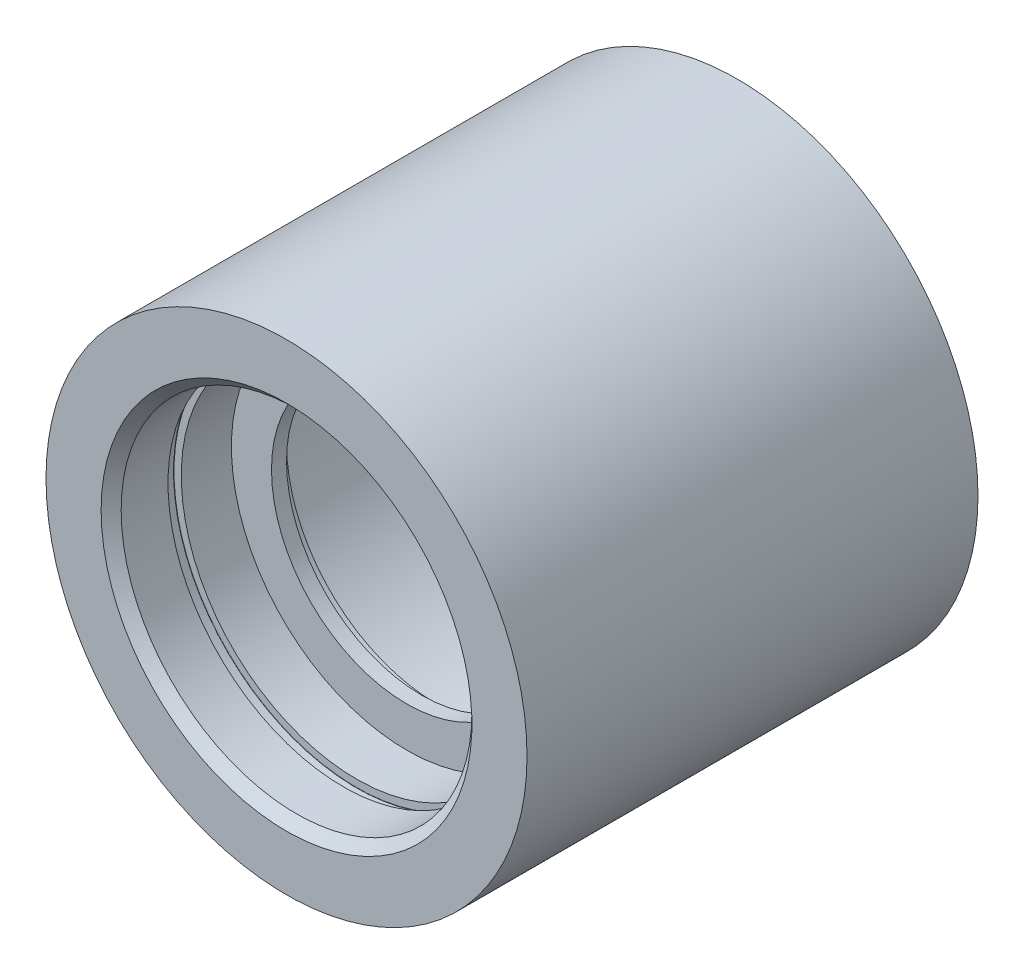
ISO-10303-21;
HEADER;
FILE_DESCRIPTION(('STEP AP214'),'2;1');
FILE_NAME('part.step','',(''),(''),'','','');
FILE_SCHEMA(('AUTOMOTIVE_DESIGN { 1 0 10303 214 1 1 1 1 }'));
ENDSEC;
DATA;
#1=APPLICATION_CONTEXT('core data for automotive mechanical design processes');
#2=APPLICATION_PROTOCOL_DEFINITION('international standard','automotive_design',2000,#1);
#3=PRODUCT_CONTEXT('',#1,'mechanical');
#4=PRODUCT('Part','Part','',(#3));
#5=PRODUCT_RELATED_PRODUCT_CATEGORY('part','',(#4));
#6=PRODUCT_DEFINITION_FORMATION('','',#4);
#7=PRODUCT_DEFINITION_CONTEXT('part definition',#1,'design');
#8=PRODUCT_DEFINITION('design','',#6,#7);
#9=PRODUCT_DEFINITION_SHAPE('','',#8);
#10=(LENGTH_UNIT() NAMED_UNIT(*) SI_UNIT(.MILLI.,.METRE.));
#11=(NAMED_UNIT(*) PLANE_ANGLE_UNIT() SI_UNIT($,.RADIAN.));
#12=(NAMED_UNIT(*) SI_UNIT($,.STERADIAN.) SOLID_ANGLE_UNIT());
#13=UNCERTAINTY_MEASURE_WITH_UNIT(LENGTH_MEASURE(1.E-05),#10,'distance_accuracy_value','');
#14=(GEOMETRIC_REPRESENTATION_CONTEXT(3) GLOBAL_UNCERTAINTY_ASSIGNED_CONTEXT((#13)) GLOBAL_UNIT_ASSIGNED_CONTEXT((#10,
#11,#12)) REPRESENTATION_CONTEXT('',''));
#15=CARTESIAN_POINT('',(0.,0.,0.));
#16=DIRECTION('',(0.,0.,1.));
#17=DIRECTION('',(1.,0.,0.));
#18=AXIS2_PLACEMENT_3D('',#15,#16,#17);
#19=CARTESIAN_POINT('',(0.,0.,0.));
#20=DIRECTION('',(0.,0.,1.));
#21=DIRECTION('',(1.,0.,0.));
#22=AXIS2_PLACEMENT_3D('',#19,#20,#21);
#23=CYLINDRICAL_SURFACE('',#22,40.);
#24=CARTESIAN_POINT('',(0.,0.,-30.));
#25=DIRECTION('',(0.,0.,1.));
#26=DIRECTION('',(1.,0.,0.));
#27=AXIS2_PLACEMENT_3D('',#24,#25,#26);
#28=CIRCLE('',#27,40.);
#29=CARTESIAN_POINT('',(40.,0.,-30.));
#30=VERTEX_POINT('',#29);
#31=EDGE_CURVE('E103',#30,#30,#28,.T.);
#32=ORIENTED_EDGE('',*,*,#31,.T.);
#33=EDGE_LOOP('',(#32));
#34=FACE_BOUND('',#33,.T.);
#35=CARTESIAN_POINT('',(0.,0.,-69.));
#36=DIRECTION('',(0.,0.,-1.));
#37=DIRECTION('',(-1.,0.,0.));
#38=AXIS2_PLACEMENT_3D('',#35,#36,#37);
#39=CIRCLE('',#38,40.);
#40=CARTESIAN_POINT('',(-40.,0.,-69.));
#41=VERTEX_POINT('',#40);
#42=EDGE_CURVE('E92',#41,#41,#39,.F.);
#43=ORIENTED_EDGE('',*,*,#42,.F.);
#44=EDGE_LOOP('',(#43));
#45=FACE_BOUND('',#44,.T.);
#46=ADVANCED_FACE('F41',(#34,#45),#23,.F.);
#47=CARTESIAN_POINT('',(0.,0.,0.));
#48=DIRECTION('',(0.,0.,1.));
#49=DIRECTION('',(1.,0.,0.));
#50=AXIS2_PLACEMENT_3D('',#47,#48,#49);
#51=CYLINDRICAL_SURFACE('',#50,35.);
#52=CARTESIAN_POINT('',(0.,0.,-24.));
#53=DIRECTION('',(0.,0.,1.));
#54=DIRECTION('',(1.,0.,0.));
#55=AXIS2_PLACEMENT_3D('',#52,#53,#54);
#56=CIRCLE('',#55,35.);
#57=CARTESIAN_POINT('',(35.,0.,-24.));
#58=VERTEX_POINT('',#57);
#59=EDGE_CURVE('E100',#58,#58,#56,.T.);
#60=ORIENTED_EDGE('',*,*,#59,.F.);
#61=EDGE_LOOP('',(#60));
#62=FACE_BOUND('',#61,.T.);
#63=CARTESIAN_POINT('',(0.,0.,-14.));
#64=DIRECTION('',(0.,0.,1.));
#65=DIRECTION('',(1.,0.,0.));
#66=AXIS2_PLACEMENT_3D('',#63,#64,#65);
#67=CIRCLE('',#66,35.);
#68=CARTESIAN_POINT('',(35.,0.,-14.));
#69=VERTEX_POINT('',#68);
#70=EDGE_CURVE('E87',#69,#69,#67,.F.);
#71=ORIENTED_EDGE('',*,*,#70,.F.);
#72=EDGE_LOOP('',(#71));
#73=FACE_BOUND('',#72,.T.);
#74=ADVANCED_FACE('F124',(#62,#73),#51,.F.);
#75=CARTESIAN_POINT('',(0.,35.,0.));
#76=DIRECTION('',(0.,0.,-1.));
#77=DIRECTION('',(-1.,0.,0.));
#78=AXIS2_PLACEMENT_3D('',#75,#76,#77);
#79=PLANE('',#78);
#80=CARTESIAN_POINT('',(0.,0.,0.));
#81=DIRECTION('',(0.,0.,-1.));
#82=DIRECTION('',(-1.,0.,0.));
#83=AXIS2_PLACEMENT_3D('',#80,#81,#82);
#84=CIRCLE('',#83,37.);
#85=CARTESIAN_POINT('',(-37.,0.,0.));
#86=VERTEX_POINT('',#85);
#87=EDGE_CURVE('E10',#86,#86,#84,.T.);
#88=ORIENTED_EDGE('',*,*,#87,.T.);
#89=EDGE_LOOP('',(#88));
#90=FACE_BOUND('',#89,.T.);
#91=CARTESIAN_POINT('',(0.,0.,0.));
#92=DIRECTION('',(0.,0.,1.));
#93=DIRECTION('',(1.,0.,0.));
#94=AXIS2_PLACEMENT_3D('',#91,#92,#93);
#95=CIRCLE('',#94,48.);
#96=CARTESIAN_POINT('',(48.,0.,0.));
#97=VERTEX_POINT('',#96);
#98=EDGE_CURVE('E89',#97,#97,#95,.T.);
#99=ORIENTED_EDGE('',*,*,#98,.T.);
#100=EDGE_LOOP('',(#99));
#101=FACE_BOUND('',#100,.T.);
#102=ADVANCED_FACE('F127',(#90,#101),#79,.F.);
#103=CARTESIAN_POINT('',(0.,0.,0.));
#104=DIRECTION('',(0.,0.,1.));
#105=DIRECTION('',(1.,0.,0.));
#106=AXIS2_PLACEMENT_3D('',#103,#104,#105);
#107=CYLINDRICAL_SURFACE('',#106,48.);
#108=ORIENTED_EDGE('',*,*,#98,.F.);
#109=EDGE_LOOP('',(#108));
#110=FACE_BOUND('',#109,.T.);
#111=CARTESIAN_POINT('',(0.,0.,-90.));
#112=DIRECTION('',(0.,0.,1.));
#113=DIRECTION('',(1.,0.,0.));
#114=AXIS2_PLACEMENT_3D('',#111,#112,#113);
#115=CIRCLE('',#114,48.);
#116=CARTESIAN_POINT('',(48.,0.,-90.));
#117=VERTEX_POINT('',#116);
#118=EDGE_CURVE('E105',#117,#117,#115,.T.);
#119=ORIENTED_EDGE('',*,*,#118,.T.);
#120=EDGE_LOOP('',(#119));
#121=FACE_BOUND('',#120,.T.);
#122=ADVANCED_FACE('F169',(#110,#121),#107,.T.);
#123=CARTESIAN_POINT('',(0.,48.,-90.));
#124=DIRECTION('',(0.,0.,1.));
#125=DIRECTION('',(1.,0.,0.));
#126=AXIS2_PLACEMENT_3D('',#123,#124,#125);
#127=PLANE('',#126);
#128=CARTESIAN_POINT('',(0.,0.,-90.));
#129=DIRECTION('',(0.,0.,1.));
#130=DIRECTION('',(1.,0.,0.));
#131=AXIS2_PLACEMENT_3D('',#128,#129,#130);
#132=CIRCLE('',#131,42.);
#133=CARTESIAN_POINT('',(42.,0.,-90.));
#134=VERTEX_POINT('',#133);
#135=EDGE_CURVE('E60',#134,#134,#132,.T.);
#136=ORIENTED_EDGE('',*,*,#135,.T.);
#137=EDGE_LOOP('',(#136));
#138=FACE_BOUND('',#137,.T.);
#139=ORIENTED_EDGE('',*,*,#118,.F.);
#140=EDGE_LOOP('',(#139));
#141=FACE_BOUND('',#140,.T.);
#142=ADVANCED_FACE('F159',(#138,#141),#127,.F.);
#143=CARTESIAN_POINT('',(0.,0.,-88.));
#144=DIRECTION('',(0.,0.,1.));
#145=DIRECTION('',(1.,0.,0.));
#146=AXIS2_PLACEMENT_3D('',#143,#144,#145);
#147=CIRCLE('',#146,40.);
#148=CARTESIAN_POINT('',(40.,0.,-88.));
#149=VERTEX_POINT('',#148);
#150=EDGE_CURVE('E52',#149,#149,#147,.F.);
#151=ORIENTED_EDGE('',*,*,#150,.T.);
#152=EDGE_LOOP('',(#151));
#153=FACE_BOUND('',#152,.T.);
#154=CARTESIAN_POINT('',(0.,0.,-71.65));
#155=DIRECTION('',(0.,0.,-1.));
#156=DIRECTION('',(-1.,0.,0.));
#157=AXIS2_PLACEMENT_3D('',#154,#155,#156);
#158=CIRCLE('',#157,40.);
#159=CARTESIAN_POINT('',(-40.,0.,-71.65));
#160=VERTEX_POINT('',#159);
#161=EDGE_CURVE('E86',#160,#160,#158,.F.);
#162=ORIENTED_EDGE('',*,*,#161,.T.);
#163=EDGE_LOOP('',(#162));
#164=FACE_BOUND('',#163,.T.);
#165=ADVANCED_FACE('F152',(#153,#164),#23,.F.);
#166=CARTESIAN_POINT('',(0.,30.,-30.));
#167=DIRECTION('',(0.,0.,1.));
#168=DIRECTION('',(1.,0.,0.));
#169=AXIS2_PLACEMENT_3D('',#166,#167,#168);
#170=PLANE('',#169);
#171=ORIENTED_EDGE('',*,*,#31,.F.);
#172=EDGE_LOOP('',(#171));
#173=FACE_BOUND('',#172,.T.);
#174=CARTESIAN_POINT('',(0.,0.,-30.));
#175=DIRECTION('',(0.,0.,1.));
#176=DIRECTION('',(1.,0.,0.));
#177=AXIS2_PLACEMENT_3D('',#174,#175,#176);
#178=CIRCLE('',#177,30.);
#179=CARTESIAN_POINT('',(30.,0.,-30.));
#180=VERTEX_POINT('',#179);
#181=EDGE_CURVE('E106',#180,#180,#178,.T.);
#182=ORIENTED_EDGE('',*,*,#181,.T.);
#183=EDGE_LOOP('',(#182));
#184=FACE_BOUND('',#183,.T.);
#185=ADVANCED_FACE('F156',(#173,#184),#170,.F.);
#186=CARTESIAN_POINT('',(0.,0.,0.));
#187=DIRECTION('',(0.,0.,1.));
#188=DIRECTION('',(1.,0.,0.));
#189=AXIS2_PLACEMENT_3D('',#186,#187,#188);
#190=CYLINDRICAL_SURFACE('',#189,30.);
#191=ORIENTED_EDGE('',*,*,#181,.F.);
#192=EDGE_LOOP('',(#191));
#193=FACE_BOUND('',#192,.T.);
#194=CARTESIAN_POINT('',(0.,0.,-27.));
#195=DIRECTION('',(0.,0.,1.));
#196=DIRECTION('',(1.,0.,0.));
#197=AXIS2_PLACEMENT_3D('',#194,#195,#196);
#198=CIRCLE('',#197,30.);
#199=CARTESIAN_POINT('',(30.,0.,-27.));
#200=VERTEX_POINT('',#199);
#201=EDGE_CURVE('E113',#200,#200,#198,.T.);
#202=ORIENTED_EDGE('',*,*,#201,.T.);
#203=EDGE_LOOP('',(#202));
#204=FACE_BOUND('',#203,.T.);
#205=ADVANCED_FACE('F167',(#193,#204),#190,.F.);
#206=CARTESIAN_POINT('',(0.,27.,-27.));
#207=DIRECTION('',(0.,0.,1.));
#208=DIRECTION('',(1.,0.,0.));
#209=AXIS2_PLACEMENT_3D('',#206,#207,#208);
#210=PLANE('',#209);
#211=ORIENTED_EDGE('',*,*,#201,.F.);
#212=EDGE_LOOP('',(#211));
#213=FACE_BOUND('',#212,.T.);
#214=CARTESIAN_POINT('',(0.,0.,-27.));
#215=DIRECTION('',(0.,0.,1.));
#216=DIRECTION('',(1.,0.,0.));
#217=AXIS2_PLACEMENT_3D('',#214,#215,#216);
#218=CIRCLE('',#217,27.);
#219=CARTESIAN_POINT('',(27.,0.,-27.));
#220=VERTEX_POINT('',#219);
#221=EDGE_CURVE('E114',#220,#220,#218,.T.);
#222=ORIENTED_EDGE('',*,*,#221,.T.);
#223=EDGE_LOOP('',(#222));
#224=FACE_BOUND('',#223,.T.);
#225=ADVANCED_FACE('F269',(#213,#224),#210,.F.);
#226=CARTESIAN_POINT('',(0.,0.,0.));
#227=DIRECTION('',(0.,0.,1.));
#228=DIRECTION('',(1.,0.,0.));
#229=AXIS2_PLACEMENT_3D('',#226,#227,#228);
#230=CYLINDRICAL_SURFACE('',#229,27.);
#231=ORIENTED_EDGE('',*,*,#221,.F.);
#232=EDGE_LOOP('',(#231));
#233=FACE_BOUND('',#232,.T.);
#234=CARTESIAN_POINT('',(0.,0.,-24.));
#235=DIRECTION('',(0.,0.,1.));
#236=DIRECTION('',(1.,0.,0.));
#237=AXIS2_PLACEMENT_3D('',#234,#235,#236);
#238=CIRCLE('',#237,27.);
#239=CARTESIAN_POINT('',(27.,0.,-24.));
#240=VERTEX_POINT('',#239);
#241=EDGE_CURVE('E120',#240,#240,#238,.T.);
#242=ORIENTED_EDGE('',*,*,#241,.T.);
#243=EDGE_LOOP('',(#242));
#244=FACE_BOUND('',#243,.T.);
#245=ADVANCED_FACE('F279',(#233,#244),#230,.F.);
#246=CARTESIAN_POINT('',(0.,27.,-24.));
#247=DIRECTION('',(0.,0.,-1.));
#248=DIRECTION('',(-1.,0.,0.));
#249=AXIS2_PLACEMENT_3D('',#246,#247,#248);
#250=PLANE('',#249);
#251=ORIENTED_EDGE('',*,*,#241,.F.);
#252=EDGE_LOOP('',(#251));
#253=FACE_BOUND('',#252,.T.);
#254=ORIENTED_EDGE('',*,*,#59,.T.);
#255=EDGE_LOOP('',(#254));
#256=FACE_BOUND('',#255,.T.);
#257=ADVANCED_FACE('F123',(#253,#256),#250,.F.);
#258=CARTESIAN_POINT('',(0.,0.,-2.00000000000002));
#259=DIRECTION('',(0.,0.,-1.));
#260=DIRECTION('',(-1.,0.,0.));
#261=AXIS2_PLACEMENT_3D('',#258,#259,#260);
#262=CIRCLE('',#261,35.);
#263=CARTESIAN_POINT('',(-35.,0.,-2.00000000000002));
#264=VERTEX_POINT('',#263);
#265=EDGE_CURVE('E47',#264,#264,#262,.F.);
#266=ORIENTED_EDGE('',*,*,#265,.T.);
#267=EDGE_LOOP('',(#266));
#268=FACE_BOUND('',#267,.T.);
#269=CARTESIAN_POINT('',(0.,0.,-11.35));
#270=DIRECTION('',(0.,0.,1.));
#271=DIRECTION('',(1.,0.,0.));
#272=AXIS2_PLACEMENT_3D('',#269,#270,#271);
#273=CIRCLE('',#272,35.);
#274=CARTESIAN_POINT('',(35.,0.,-11.35));
#275=VERTEX_POINT('',#274);
#276=EDGE_CURVE('E91',#275,#275,#273,.F.);
#277=ORIENTED_EDGE('',*,*,#276,.T.);
#278=EDGE_LOOP('',(#277));
#279=FACE_BOUND('',#278,.T.);
#280=ADVANCED_FACE('F129',(#268,#279),#51,.F.);
#281=CARTESIAN_POINT('',(0.,0.,-11.35));
#282=DIRECTION('',(0.,0.,1.));
#283=DIRECTION('',(1.,0.,0.));
#284=AXIS2_PLACEMENT_3D('',#281,#282,#283);
#285=PLANE('',#284);
#286=CARTESIAN_POINT('',(0.,0.,-11.35));
#287=DIRECTION('',(0.,0.,1.));
#288=DIRECTION('',(1.,0.,0.));
#289=AXIS2_PLACEMENT_3D('',#286,#287,#288);
#290=CIRCLE('',#289,36.45);
#291=CARTESIAN_POINT('',(36.45,0.,-11.35));
#292=VERTEX_POINT('',#291);
#293=EDGE_CURVE('E62',#292,#292,#290,.F.);
#294=ORIENTED_EDGE('',*,*,#293,.T.);
#295=EDGE_LOOP('',(#294));
#296=FACE_BOUND('',#295,.T.);
#297=ORIENTED_EDGE('',*,*,#276,.F.);
#298=EDGE_LOOP('',(#297));
#299=FACE_BOUND('',#298,.T.);
#300=ADVANCED_FACE('F139',(#296,#299),#285,.F.);
#301=CARTESIAN_POINT('',(0.,0.,-14.));
#302=DIRECTION('',(0.,0.,1.));
#303=DIRECTION('',(1.,0.,0.));
#304=AXIS2_PLACEMENT_3D('',#301,#302,#303);
#305=PLANE('',#304);
#306=CARTESIAN_POINT('',(0.,0.,-14.));
#307=DIRECTION('',(0.,0.,1.));
#308=DIRECTION('',(1.,0.,0.));
#309=AXIS2_PLACEMENT_3D('',#306,#307,#308);
#310=CIRCLE('',#309,36.45);
#311=CARTESIAN_POINT('',(36.45,0.,-14.));
#312=VERTEX_POINT('',#311);
#313=EDGE_CURVE('E61',#312,#312,#310,.T.);
#314=ORIENTED_EDGE('',*,*,#313,.T.);
#315=EDGE_LOOP('',(#314));
#316=FACE_BOUND('',#315,.T.);
#317=ORIENTED_EDGE('',*,*,#70,.T.);
#318=EDGE_LOOP('',(#317));
#319=FACE_BOUND('',#318,.T.);
#320=ADVANCED_FACE('F134',(#316,#319),#305,.T.);
#321=CARTESIAN_POINT('',(0.,0.,-11.35));
#322=DIRECTION('',(0.,0.,-1.));
#323=DIRECTION('',(-1.,0.,0.));
#324=AXIS2_PLACEMENT_3D('',#321,#322,#323);
#325=CYLINDRICAL_SURFACE('',#324,36.5);
#326=CARTESIAN_POINT('',(0.,0.,-11.4));
#327=DIRECTION('',(0.,0.,1.));
#328=DIRECTION('',(1.,0.,0.));
#329=AXIS2_PLACEMENT_3D('',#326,#327,#328);
#330=CIRCLE('',#329,36.5);
#331=CARTESIAN_POINT('',(36.5,0.,-11.4));
#332=VERTEX_POINT('',#331);
#333=EDGE_CURVE('E69',#332,#332,#330,.T.);
#334=ORIENTED_EDGE('',*,*,#333,.T.);
#335=EDGE_LOOP('',(#334));
#336=FACE_BOUND('',#335,.T.);
#337=CARTESIAN_POINT('',(0.,0.,-13.95));
#338=DIRECTION('',(0.,0.,1.));
#339=DIRECTION('',(1.,0.,0.));
#340=AXIS2_PLACEMENT_3D('',#337,#338,#339);
#341=CIRCLE('',#340,36.5);
#342=CARTESIAN_POINT('',(36.5,0.,-13.95));
#343=VERTEX_POINT('',#342);
#344=EDGE_CURVE('E72',#343,#343,#341,.F.);
#345=ORIENTED_EDGE('',*,*,#344,.T.);
#346=EDGE_LOOP('',(#345));
#347=FACE_BOUND('',#346,.T.);
#348=ADVANCED_FACE('F133',(#336,#347),#325,.F.);
#349=CARTESIAN_POINT('',(0.,0.,-71.65));
#350=DIRECTION('',(0.,0.,-1.));
#351=DIRECTION('',(-1.,0.,0.));
#352=AXIS2_PLACEMENT_3D('',#349,#350,#351);
#353=PLANE('',#352);
#354=CARTESIAN_POINT('',(0.,0.,-71.65));
#355=DIRECTION('',(0.,0.,-1.));
#356=DIRECTION('',(-1.,0.,0.));
#357=AXIS2_PLACEMENT_3D('',#354,#355,#356);
#358=CIRCLE('',#357,41.7);
#359=CARTESIAN_POINT('',(-41.7,0.,-71.65));
#360=VERTEX_POINT('',#359);
#361=EDGE_CURVE('E80',#360,#360,#358,.F.);
#362=ORIENTED_EDGE('',*,*,#361,.T.);
#363=EDGE_LOOP('',(#362));
#364=FACE_BOUND('',#363,.T.);
#365=ORIENTED_EDGE('',*,*,#161,.F.);
#366=EDGE_LOOP('',(#365));
#367=FACE_BOUND('',#366,.T.);
#368=ADVANCED_FACE('F144',(#364,#367),#353,.F.);
#369=CARTESIAN_POINT('',(0.,0.,-69.));
#370=DIRECTION('',(0.,0.,-1.));
#371=DIRECTION('',(-1.,0.,0.));
#372=AXIS2_PLACEMENT_3D('',#369,#370,#371);
#373=PLANE('',#372);
#374=CARTESIAN_POINT('',(0.,0.,-69.));
#375=DIRECTION('',(0.,0.,-1.));
#376=DIRECTION('',(-1.,0.,0.));
#377=AXIS2_PLACEMENT_3D('',#374,#375,#376);
#378=CIRCLE('',#377,41.7);
#379=CARTESIAN_POINT('',(-41.7,0.,-69.));
#380=VERTEX_POINT('',#379);
#381=EDGE_CURVE('E74',#380,#380,#378,.T.);
#382=ORIENTED_EDGE('',*,*,#381,.T.);
#383=EDGE_LOOP('',(#382));
#384=FACE_BOUND('',#383,.T.);
#385=ORIENTED_EDGE('',*,*,#42,.T.);
#386=EDGE_LOOP('',(#385));
#387=FACE_BOUND('',#386,.T.);
#388=ADVANCED_FACE('F171',(#384,#387),#373,.T.);
#389=CARTESIAN_POINT('',(0.,0.,-71.65));
#390=DIRECTION('',(0.,0.,1.));
#391=DIRECTION('',(1.,0.,0.));
#392=AXIS2_PLACEMENT_3D('',#389,#390,#391);
#393=CYLINDRICAL_SURFACE('',#392,41.75);
#394=CARTESIAN_POINT('',(0.,0.,-71.6));
#395=DIRECTION('',(0.,0.,-1.));
#396=DIRECTION('',(-1.,0.,0.));
#397=AXIS2_PLACEMENT_3D('',#394,#395,#396);
#398=CIRCLE('',#397,41.75);
#399=CARTESIAN_POINT('',(-41.75,0.,-71.6));
#400=VERTEX_POINT('',#399);
#401=EDGE_CURVE('E78',#400,#400,#398,.T.);
#402=ORIENTED_EDGE('',*,*,#401,.T.);
#403=EDGE_LOOP('',(#402));
#404=FACE_BOUND('',#403,.T.);
#405=CARTESIAN_POINT('',(0.,0.,-69.05));
#406=DIRECTION('',(0.,0.,-1.));
#407=DIRECTION('',(-1.,0.,0.));
#408=AXIS2_PLACEMENT_3D('',#405,#406,#407);
#409=CIRCLE('',#408,41.75);
#410=CARTESIAN_POINT('',(-41.75,0.,-69.05));
#411=VERTEX_POINT('',#410);
#412=EDGE_CURVE('E81',#411,#411,#409,.F.);
#413=ORIENTED_EDGE('',*,*,#412,.T.);
#414=EDGE_LOOP('',(#413));
#415=FACE_BOUND('',#414,.T.);
#416=ADVANCED_FACE('F183',(#404,#415),#393,.F.);
#417=CARTESIAN_POINT('',(0.,0.,-71.6));
#418=DIRECTION('',(0.,0.,-1.));
#419=DIRECTION('',(-1.,0.,0.));
#420=AXIS2_PLACEMENT_3D('',#417,#418,#419);
#421=TOROIDAL_SURFACE('',#420,41.7,0.05);
#422=ORIENTED_EDGE('',*,*,#361,.F.);
#423=EDGE_LOOP('',(#422));
#424=FACE_BOUND('',#423,.T.);
#425=ORIENTED_EDGE('',*,*,#401,.F.);
#426=EDGE_LOOP('',(#425));
#427=FACE_BOUND('',#426,.T.);
#428=ADVANCED_FACE('F188',(#424,#427),#421,.F.);
#429=CARTESIAN_POINT('',(0.,0.,-69.05));
#430=DIRECTION('',(0.,0.,-1.));
#431=DIRECTION('',(-1.,0.,0.));
#432=AXIS2_PLACEMENT_3D('',#429,#430,#431);
#433=TOROIDAL_SURFACE('',#432,41.7,0.05);
#434=ORIENTED_EDGE('',*,*,#412,.F.);
#435=EDGE_LOOP('',(#434));
#436=FACE_BOUND('',#435,.T.);
#437=ORIENTED_EDGE('',*,*,#381,.F.);
#438=EDGE_LOOP('',(#437));
#439=FACE_BOUND('',#438,.T.);
#440=ADVANCED_FACE('F191',(#436,#439),#433,.F.);
#441=CARTESIAN_POINT('',(0.,0.,-11.4));
#442=DIRECTION('',(0.,0.,1.));
#443=DIRECTION('',(1.,0.,0.));
#444=AXIS2_PLACEMENT_3D('',#441,#442,#443);
#445=TOROIDAL_SURFACE('',#444,36.45,0.05);
#446=ORIENTED_EDGE('',*,*,#293,.F.);
#447=EDGE_LOOP('',(#446));
#448=FACE_BOUND('',#447,.T.);
#449=ORIENTED_EDGE('',*,*,#333,.F.);
#450=EDGE_LOOP('',(#449));
#451=FACE_BOUND('',#450,.T.);
#452=ADVANCED_FACE('F199',(#448,#451),#445,.F.);
#453=CARTESIAN_POINT('',(0.,0.,-13.95));
#454=DIRECTION('',(0.,0.,1.));
#455=DIRECTION('',(1.,0.,0.));
#456=AXIS2_PLACEMENT_3D('',#453,#454,#455);
#457=TOROIDAL_SURFACE('',#456,36.45,0.05);
#458=ORIENTED_EDGE('',*,*,#344,.F.);
#459=EDGE_LOOP('',(#458));
#460=FACE_BOUND('',#459,.T.);
#461=ORIENTED_EDGE('',*,*,#313,.F.);
#462=EDGE_LOOP('',(#461));
#463=FACE_BOUND('',#462,.T.);
#464=ADVANCED_FACE('F209',(#460,#463),#457,.F.);
#465=CARTESIAN_POINT('',(0.,0.,-90.));
#466=DIRECTION('',(0.,0.,-1.));
#467=DIRECTION('',(-1.,0.,0.));
#468=AXIS2_PLACEMENT_3D('',#465,#466,#467);
#469=CONICAL_SURFACE('',#468,42.,0.785398163397448);
#470=ORIENTED_EDGE('',*,*,#150,.F.);
#471=EDGE_LOOP('',(#470));
#472=FACE_BOUND('',#471,.T.);
#473=ORIENTED_EDGE('',*,*,#135,.F.);
#474=EDGE_LOOP('',(#473));
#475=FACE_BOUND('',#474,.T.);
#476=ADVANCED_FACE('F213',(#472,#475),#469,.F.);
#477=CARTESIAN_POINT('',(0.,0.,-2.00000000000002));
#478=DIRECTION('',(0.,0.,1.));
#479=DIRECTION('',(1.,0.,0.));
#480=AXIS2_PLACEMENT_3D('',#477,#478,#479);
#481=CONICAL_SURFACE('',#480,35.,0.785398163397448);
#482=ORIENTED_EDGE('',*,*,#87,.F.);
#483=EDGE_LOOP('',(#482));
#484=FACE_BOUND('',#483,.T.);
#485=ORIENTED_EDGE('',*,*,#265,.F.);
#486=EDGE_LOOP('',(#485));
#487=FACE_BOUND('',#486,.T.);
#488=ADVANCED_FACE('F42',(#484,#487),#481,.F.);
#489=CLOSED_SHELL('',(#46,#74,#102,#122,#142,#165,#185,#205,#225,#245,#257,#280,#300,#320,#348,
#368,#388,#416,#428,#440,#452,#464,#476,#488));
#490=MANIFOLD_SOLID_BREP('B2',#489);
#491=ADVANCED_BREP_SHAPE_REPRESENTATION('',(#18,#490),#14);
#492=SHAPE_DEFINITION_REPRESENTATION(#9,#491);
ENDSEC;
END-ISO-10303-21;
